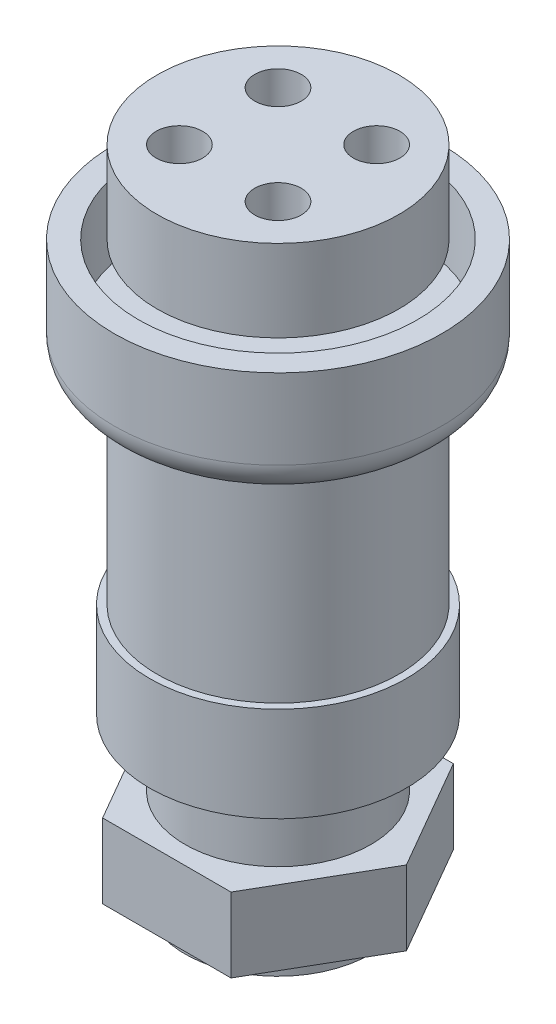
ISO-10303-21;
HEADER;
FILE_DESCRIPTION(('STEP AP214'),'2;1');
FILE_NAME('part.step','',(''),(''),'','','');
FILE_SCHEMA(('AUTOMOTIVE_DESIGN { 1 0 10303 214 1 1 1 1 }'));
ENDSEC;
DATA;
#1=APPLICATION_CONTEXT('core data for automotive mechanical design processes');
#2=APPLICATION_PROTOCOL_DEFINITION('international standard','automotive_design',2000,#1);
#3=PRODUCT_CONTEXT('',#1,'mechanical');
#4=PRODUCT('Part','Part','',(#3));
#5=PRODUCT_RELATED_PRODUCT_CATEGORY('part','',(#4));
#6=PRODUCT_DEFINITION_FORMATION('','',#4);
#7=PRODUCT_DEFINITION_CONTEXT('part definition',#1,'design');
#8=PRODUCT_DEFINITION('design','',#6,#7);
#9=PRODUCT_DEFINITION_SHAPE('','',#8);
#10=(LENGTH_UNIT() NAMED_UNIT(*) SI_UNIT(.MILLI.,.METRE.));
#11=(NAMED_UNIT(*) PLANE_ANGLE_UNIT() SI_UNIT($,.RADIAN.));
#12=(NAMED_UNIT(*) SI_UNIT($,.STERADIAN.) SOLID_ANGLE_UNIT());
#13=UNCERTAINTY_MEASURE_WITH_UNIT(LENGTH_MEASURE(1.E-05),#10,'distance_accuracy_value','');
#14=(GEOMETRIC_REPRESENTATION_CONTEXT(3) GLOBAL_UNCERTAINTY_ASSIGNED_CONTEXT((#13)) GLOBAL_UNIT_ASSIGNED_CONTEXT((#10,
#11,#12)) REPRESENTATION_CONTEXT('',''));
#15=CARTESIAN_POINT('',(0.,0.,0.));
#16=DIRECTION('',(0.,0.,1.));
#17=DIRECTION('',(1.,0.,0.));
#18=AXIS2_PLACEMENT_3D('',#15,#16,#17);
#19=CARTESIAN_POINT('',(14.2491519079586,-25.873716184257,0.));
#20=DIRECTION('',(0.,-1.,0.));
#21=DIRECTION('',(0.,0.,-1.));
#22=AXIS2_PLACEMENT_3D('',#19,#20,#21);
#23=CYLINDRICAL_SURFACE('',#22,5.);
#24=CARTESIAN_POINT('',(14.2491519079586,-18.17860251967,0.));
#25=DIRECTION('',(0.,-1.,0.));
#26=DIRECTION('',(0.,0.,-1.));
#27=AXIS2_PLACEMENT_3D('',#24,#25,#26);
#28=CIRCLE('',#27,5.);
#29=CARTESIAN_POINT('',(14.2491519079586,-18.17860251967,-5.));
#30=VERTEX_POINT('',#29);
#31=EDGE_CURVE('E251',#30,#30,#28,.T.);
#32=ORIENTED_EDGE('',*,*,#31,.T.);
#33=EDGE_LOOP('',(#32));
#34=FACE_BOUND('',#33,.T.);
#35=CARTESIAN_POINT('',(14.2491519079586,-20.773716184257,0.));
#36=DIRECTION('',(0.,-1.,0.));
#37=DIRECTION('',(0.,0.,-1.));
#38=AXIS2_PLACEMENT_3D('',#35,#36,#37);
#39=CIRCLE('',#38,5.);
#40=CARTESIAN_POINT('',(14.2491519079586,-20.773716184257,-5.));
#41=VERTEX_POINT('',#40);
#42=EDGE_CURVE('E225',#41,#41,#39,.F.);
#43=ORIENTED_EDGE('',*,*,#42,.T.);
#44=EDGE_LOOP('',(#43));
#45=FACE_BOUND('',#44,.T.);
#46=ADVANCED_FACE('F42',(#34,#45),#23,.T.);
#47=CARTESIAN_POINT('',(21.4991519079586,-1.1,0.));
#48=DIRECTION('',(0.,-1.,0.));
#49=DIRECTION('',(0.,0.,-1.));
#50=AXIS2_PLACEMENT_3D('',#47,#48,#49);
#51=PLANE('',#50);
#52=CARTESIAN_POINT('',(14.2491519079586,-1.1,0.));
#53=DIRECTION('',(0.,-1.,0.));
#54=DIRECTION('',(0.,0.,-1.));
#55=AXIS2_PLACEMENT_3D('',#52,#53,#54);
#56=CIRCLE('',#55,7.1);
#57=CARTESIAN_POINT('',(14.2491519079586,-1.1,-7.1));
#58=VERTEX_POINT('',#57);
#59=EDGE_CURVE('E244',#58,#58,#56,.T.);
#60=ORIENTED_EDGE('',*,*,#59,.T.);
#61=EDGE_LOOP('',(#60));
#62=FACE_BOUND('',#61,.T.);
#63=CARTESIAN_POINT('',(14.2491519079586,-1.1,0.));
#64=DIRECTION('',(0.,-1.,0.));
#65=DIRECTION('',(0.,0.,-1.));
#66=AXIS2_PLACEMENT_3D('',#63,#64,#65);
#67=CIRCLE('',#66,6.5);
#68=CARTESIAN_POINT('',(14.2491519079586,-1.1,-6.5));
#69=VERTEX_POINT('',#68);
#70=EDGE_CURVE('E240',#69,#69,#67,.T.);
#71=ORIENTED_EDGE('',*,*,#70,.F.);
#72=EDGE_LOOP('',(#71));
#73=FACE_BOUND('',#72,.T.);
#74=ADVANCED_FACE('F181',(#62,#73),#51,.T.);
#75=CARTESIAN_POINT('',(14.2491519079586,-25.873716184257,0.));
#76=DIRECTION('',(0.,-1.,0.));
#77=DIRECTION('',(0.,0.,-1.));
#78=AXIS2_PLACEMENT_3D('',#75,#76,#77);
#79=CYLINDRICAL_SURFACE('',#78,6.5);
#80=ORIENTED_EDGE('',*,*,#70,.T.);
#81=EDGE_LOOP('',(#80));
#82=FACE_BOUND('',#81,.T.);
#83=CARTESIAN_POINT('',(14.2491519079586,-12.1,0.));
#84=DIRECTION('',(0.,-1.,0.));
#85=DIRECTION('',(0.,0.,-1.));
#86=AXIS2_PLACEMENT_3D('',#83,#84,#85);
#87=CIRCLE('',#86,6.5);
#88=CARTESIAN_POINT('',(14.2491519079586,-12.1,-6.5));
#89=VERTEX_POINT('',#88);
#90=EDGE_CURVE('E243',#89,#89,#87,.T.);
#91=ORIENTED_EDGE('',*,*,#90,.F.);
#92=EDGE_LOOP('',(#91));
#93=FACE_BOUND('',#92,.T.);
#94=ADVANCED_FACE('F186',(#82,#93),#79,.T.);
#95=CARTESIAN_POINT('',(20.7491519079586,-12.1,0.));
#96=DIRECTION('',(0.,1.,0.));
#97=DIRECTION('',(0.,0.,1.));
#98=AXIS2_PLACEMENT_3D('',#95,#96,#97);
#99=PLANE('',#98);
#100=ORIENTED_EDGE('',*,*,#90,.T.);
#101=EDGE_LOOP('',(#100));
#102=FACE_BOUND('',#101,.T.);
#103=CARTESIAN_POINT('',(14.2491519079586,-12.1,0.));
#104=DIRECTION('',(0.,-1.,0.));
#105=DIRECTION('',(0.,0.,-1.));
#106=AXIS2_PLACEMENT_3D('',#103,#104,#105);
#107=CIRCLE('',#106,6.9);
#108=CARTESIAN_POINT('',(14.2491519079586,-12.1,-6.9));
#109=VERTEX_POINT('',#108);
#110=EDGE_CURVE('E247',#109,#109,#107,.T.);
#111=ORIENTED_EDGE('',*,*,#110,.F.);
#112=EDGE_LOOP('',(#111));
#113=FACE_BOUND('',#112,.T.);
#114=ADVANCED_FACE('F268',(#102,#113),#99,.T.);
#115=CARTESIAN_POINT('',(14.2491519079586,-25.873716184257,0.));
#116=DIRECTION('',(0.,-1.,0.));
#117=DIRECTION('',(0.,0.,-1.));
#118=AXIS2_PLACEMENT_3D('',#115,#116,#117);
#119=CYLINDRICAL_SURFACE('',#118,6.9);
#120=ORIENTED_EDGE('',*,*,#110,.T.);
#121=EDGE_LOOP('',(#120));
#122=FACE_BOUND('',#121,.T.);
#123=CARTESIAN_POINT('',(14.2491519079586,-17.2,0.));
#124=DIRECTION('',(0.,-1.,0.));
#125=DIRECTION('',(0.,0.,-1.));
#126=AXIS2_PLACEMENT_3D('',#123,#124,#125);
#127=CIRCLE('',#126,6.9);
#128=CARTESIAN_POINT('',(14.2491519079586,-17.2,-6.9));
#129=VERTEX_POINT('',#128);
#130=EDGE_CURVE('E152',#129,#129,#127,.T.);
#131=ORIENTED_EDGE('',*,*,#130,.F.);
#132=EDGE_LOOP('',(#131));
#133=FACE_BOUND('',#132,.T.);
#134=ADVANCED_FACE('F271',(#122,#133),#119,.T.);
#135=CARTESIAN_POINT('',(14.2491519079586,-18.17860251967,0.));
#136=DIRECTION('',(0.,1.,0.));
#137=DIRECTION('',(0.,0.,1.));
#138=AXIS2_PLACEMENT_3D('',#135,#136,#137);
#139=CONICAL_SURFACE('',#138,5.,1.09517820827461);
#140=ORIENTED_EDGE('',*,*,#130,.T.);
#141=EDGE_LOOP('',(#140));
#142=FACE_BOUND('',#141,.T.);
#143=ORIENTED_EDGE('',*,*,#31,.F.);
#144=EDGE_LOOP('',(#143));
#145=FACE_BOUND('',#144,.T.);
#146=ADVANCED_FACE('F193',(#142,#145),#139,.T.);
#147=CARTESIAN_POINT('',(10.7991519079585,-20.773716184257,5.97557528611259));
#148=DIRECTION('',(-0.866025403784441,0.,0.499999999999995));
#149=DIRECTION('',(0.499999999999995,0.,0.866025403784442));
#150=AXIS2_PLACEMENT_3D('',#147,#148,#149);
#151=PLANE('',#150);
#152=DIRECTION('',(-0.499999999999995,0.,-0.866025403784441));
#153=VECTOR('',#152,1.);
#154=CARTESIAN_POINT('',(10.7991519079585,-24.773716184257,5.97557528611259));
#155=LINE('',#154,#153);
#156=CARTESIAN_POINT('',(10.7991519079585,-24.773716184257,5.97557528611259));
#157=VERTEX_POINT('',#156);
#158=CARTESIAN_POINT('',(7.34915190795857,-24.773716184257,0.));
#159=VERTEX_POINT('',#158);
#160=EDGE_CURVE('E113',#157,#159,#155,.T.);
#161=ORIENTED_EDGE('',*,*,#160,.F.);
#162=DIRECTION('',(0.,-1.,0.));
#163=VECTOR('',#162,1.);
#164=CARTESIAN_POINT('',(10.7991519079585,-20.773716184257,5.97557528611259));
#165=LINE('',#164,#163);
#166=CARTESIAN_POINT('',(10.7991519079585,-20.773716184257,5.97557528611259));
#167=VERTEX_POINT('',#166);
#168=EDGE_CURVE('E100',#167,#157,#165,.T.);
#169=ORIENTED_EDGE('',*,*,#168,.F.);
#170=DIRECTION('',(-0.499999999999995,0.,-0.866025403784441));
#171=VECTOR('',#170,1.);
#172=CARTESIAN_POINT('',(10.7991519079585,-20.773716184257,5.97557528611259));
#173=LINE('',#172,#171);
#174=CARTESIAN_POINT('',(7.34915190795857,-20.773716184257,0.));
#175=VERTEX_POINT('',#174);
#176=EDGE_CURVE('E150',#167,#175,#173,.T.);
#177=ORIENTED_EDGE('',*,*,#176,.T.);
#178=DIRECTION('',(0.,-1.,0.));
#179=VECTOR('',#178,1.);
#180=CARTESIAN_POINT('',(7.34915190795857,-20.773716184257,0.));
#181=LINE('',#180,#179);
#182=EDGE_CURVE('E115',#175,#159,#181,.T.);
#183=ORIENTED_EDGE('',*,*,#182,.T.);
#184=EDGE_LOOP('',(#161,#169,#177,#183));
#185=FACE_BOUND('',#184,.T.);
#186=ADVANCED_FACE('F114',(#185),#151,.T.);
#187=CARTESIAN_POINT('',(17.6991519079585,-20.773716184257,5.97557528611266));
#188=DIRECTION('',(0.,0.,1.));
#189=DIRECTION('',(1.,0.,0.));
#190=AXIS2_PLACEMENT_3D('',#187,#188,#189);
#191=PLANE('',#190);
#192=DIRECTION('',(-1.,0.,0.));
#193=VECTOR('',#192,1.);
#194=CARTESIAN_POINT('',(17.6991519079585,-24.773716184257,5.97557528611266));
#195=LINE('',#194,#193);
#196=CARTESIAN_POINT('',(17.6991519079585,-24.773716184257,5.97557528611266));
#197=VERTEX_POINT('',#196);
#198=EDGE_CURVE('E104',#197,#157,#195,.T.);
#199=ORIENTED_EDGE('',*,*,#198,.F.);
#200=DIRECTION('',(0.,-1.,0.));
#201=VECTOR('',#200,1.);
#202=CARTESIAN_POINT('',(17.6991519079585,-20.773716184257,5.97557528611266));
#203=LINE('',#202,#201);
#204=CARTESIAN_POINT('',(17.6991519079585,-20.773716184257,5.97557528611266));
#205=VERTEX_POINT('',#204);
#206=EDGE_CURVE('E142',#205,#197,#203,.T.);
#207=ORIENTED_EDGE('',*,*,#206,.F.);
#208=DIRECTION('',(-1.,0.,0.));
#209=VECTOR('',#208,1.);
#210=CARTESIAN_POINT('',(17.6991519079585,-20.773716184257,5.97557528611266));
#211=LINE('',#210,#209);
#212=EDGE_CURVE('E106',#205,#167,#211,.T.);
#213=ORIENTED_EDGE('',*,*,#212,.T.);
#214=ORIENTED_EDGE('',*,*,#168,.T.);
#215=EDGE_LOOP('',(#199,#207,#213,#214));
#216=FACE_BOUND('',#215,.T.);
#217=ADVANCED_FACE('F102',(#216),#191,.T.);
#218=CARTESIAN_POINT('',(21.1491519079586,-20.773716184257,0.));
#219=DIRECTION('',(0.866025403784435,0.,0.500000000000007));
#220=DIRECTION('',(0.500000000000007,0.,-0.866025403784435));
#221=AXIS2_PLACEMENT_3D('',#218,#219,#220);
#222=PLANE('',#221);
#223=DIRECTION('',(-0.500000000000007,0.,0.866025403784435));
#224=VECTOR('',#223,1.);
#225=CARTESIAN_POINT('',(21.1491519079586,-24.773716184257,0.));
#226=LINE('',#225,#224);
#227=CARTESIAN_POINT('',(21.1491519079586,-24.773716184257,0.));
#228=VERTEX_POINT('',#227);
#229=EDGE_CURVE('E124',#228,#197,#226,.T.);
#230=ORIENTED_EDGE('',*,*,#229,.F.);
#231=DIRECTION('',(0.,-1.,0.));
#232=VECTOR('',#231,1.);
#233=CARTESIAN_POINT('',(21.1491519079586,-20.773716184257,0.));
#234=LINE('',#233,#232);
#235=CARTESIAN_POINT('',(21.1491519079586,-20.773716184257,0.));
#236=VERTEX_POINT('',#235);
#237=EDGE_CURVE('E91',#236,#228,#234,.T.);
#238=ORIENTED_EDGE('',*,*,#237,.F.);
#239=DIRECTION('',(-0.500000000000007,0.,0.866025403784435));
#240=VECTOR('',#239,1.);
#241=CARTESIAN_POINT('',(21.1491519079586,-20.773716184257,0.));
#242=LINE('',#241,#240);
#243=EDGE_CURVE('E110',#236,#205,#242,.T.);
#244=ORIENTED_EDGE('',*,*,#243,.T.);
#245=ORIENTED_EDGE('',*,*,#206,.T.);
#246=EDGE_LOOP('',(#230,#238,#244,#245));
#247=FACE_BOUND('',#246,.T.);
#248=ADVANCED_FACE('F210',(#247),#222,.T.);
#249=CARTESIAN_POINT('',(17.6991519079586,-20.773716184257,-5.97557528611261));
#250=DIRECTION('',(0.866025403784442,0.,-0.499999999999995));
#251=DIRECTION('',(-0.499999999999995,0.,-0.866025403784442));
#252=AXIS2_PLACEMENT_3D('',#249,#250,#251);
#253=PLANE('',#252);
#254=DIRECTION('',(0.499999999999995,0.,0.866025403784442));
#255=VECTOR('',#254,1.);
#256=CARTESIAN_POINT('',(17.6991519079586,-24.773716184257,-5.97557528611261));
#257=LINE('',#256,#255);
#258=CARTESIAN_POINT('',(17.6991519079586,-24.773716184257,-5.97557528611261));
#259=VERTEX_POINT('',#258);
#260=EDGE_CURVE('E130',#259,#228,#257,.T.);
#261=ORIENTED_EDGE('',*,*,#260,.F.);
#262=DIRECTION('',(0.,-1.,0.));
#263=VECTOR('',#262,1.);
#264=CARTESIAN_POINT('',(17.6991519079586,-20.773716184257,-5.97557528611261));
#265=LINE('',#264,#263);
#266=CARTESIAN_POINT('',(17.6991519079586,-20.773716184257,-5.97557528611261));
#267=VERTEX_POINT('',#266);
#268=EDGE_CURVE('E147',#267,#259,#265,.T.);
#269=ORIENTED_EDGE('',*,*,#268,.F.);
#270=DIRECTION('',(0.499999999999995,0.,0.866025403784442));
#271=VECTOR('',#270,1.);
#272=CARTESIAN_POINT('',(17.6991519079586,-20.773716184257,-5.97557528611261));
#273=LINE('',#272,#271);
#274=EDGE_CURVE('E143',#267,#236,#273,.T.);
#275=ORIENTED_EDGE('',*,*,#274,.T.);
#276=ORIENTED_EDGE('',*,*,#237,.T.);
#277=EDGE_LOOP('',(#261,#269,#275,#276));
#278=FACE_BOUND('',#277,.T.);
#279=ADVANCED_FACE('F207',(#278),#253,.T.);
#280=CARTESIAN_POINT('',(10.7991519079586,-20.773716184257,-5.97557528611263));
#281=DIRECTION('',(0.,0.,-1.));
#282=DIRECTION('',(-1.,0.,0.));
#283=AXIS2_PLACEMENT_3D('',#280,#281,#282);
#284=PLANE('',#283);
#285=DIRECTION('',(1.,0.,0.));
#286=VECTOR('',#285,1.);
#287=CARTESIAN_POINT('',(10.7991519079586,-24.773716184257,-5.97557528611263));
#288=LINE('',#287,#286);
#289=CARTESIAN_POINT('',(10.7991519079586,-24.773716184257,-5.97557528611263));
#290=VERTEX_POINT('',#289);
#291=EDGE_CURVE('E135',#290,#259,#288,.T.);
#292=ORIENTED_EDGE('',*,*,#291,.F.);
#293=DIRECTION('',(0.,-1.,0.));
#294=VECTOR('',#293,1.);
#295=CARTESIAN_POINT('',(10.7991519079586,-20.773716184257,-5.97557528611263));
#296=LINE('',#295,#294);
#297=CARTESIAN_POINT('',(10.7991519079586,-20.773716184257,-5.97557528611263));
#298=VERTEX_POINT('',#297);
#299=EDGE_CURVE('E58',#298,#290,#296,.T.);
#300=ORIENTED_EDGE('',*,*,#299,.F.);
#301=DIRECTION('',(1.,0.,0.));
#302=VECTOR('',#301,1.);
#303=CARTESIAN_POINT('',(10.7991519079586,-20.773716184257,-5.97557528611263));
#304=LINE('',#303,#302);
#305=EDGE_CURVE('E145',#298,#267,#304,.T.);
#306=ORIENTED_EDGE('',*,*,#305,.T.);
#307=ORIENTED_EDGE('',*,*,#268,.T.);
#308=EDGE_LOOP('',(#292,#300,#306,#307));
#309=FACE_BOUND('',#308,.T.);
#310=ADVANCED_FACE('F204',(#309),#284,.T.);
#311=CARTESIAN_POINT('',(7.34915190795857,-20.773716184257,0.));
#312=DIRECTION('',(-0.866025403784438,0.,-0.500000000000001));
#313=DIRECTION('',(-0.500000000000001,0.,0.866025403784438));
#314=AXIS2_PLACEMENT_3D('',#311,#312,#313);
#315=PLANE('',#314);
#316=DIRECTION('',(0.500000000000001,0.,-0.866025403784438));
#317=VECTOR('',#316,1.);
#318=CARTESIAN_POINT('',(7.34915190795857,-24.773716184257,0.));
#319=LINE('',#318,#317);
#320=EDGE_CURVE('E118',#159,#290,#319,.T.);
#321=ORIENTED_EDGE('',*,*,#320,.F.);
#322=ORIENTED_EDGE('',*,*,#182,.F.);
#323=DIRECTION('',(0.500000000000001,0.,-0.866025403784438));
#324=VECTOR('',#323,1.);
#325=CARTESIAN_POINT('',(7.34915190795857,-20.773716184257,0.));
#326=LINE('',#325,#324);
#327=EDGE_CURVE('E148',#175,#298,#326,.T.);
#328=ORIENTED_EDGE('',*,*,#327,.T.);
#329=ORIENTED_EDGE('',*,*,#299,.T.);
#330=EDGE_LOOP('',(#321,#322,#328,#329));
#331=FACE_BOUND('',#330,.T.);
#332=ADVANCED_FACE('F200',(#331),#315,.T.);
#333=CARTESIAN_POINT('',(0.,-20.773716184257,0.));
#334=DIRECTION('',(0.,-1.,0.));
#335=DIRECTION('',(0.,0.,-1.));
#336=AXIS2_PLACEMENT_3D('',#333,#334,#335);
#337=PLANE('',#336);
#338=ORIENTED_EDGE('',*,*,#42,.F.);
#339=EDGE_LOOP('',(#338));
#340=FACE_BOUND('',#339,.T.);
#341=ORIENTED_EDGE('',*,*,#176,.F.);
#342=ORIENTED_EDGE('',*,*,#212,.F.);
#343=ORIENTED_EDGE('',*,*,#243,.F.);
#344=ORIENTED_EDGE('',*,*,#274,.F.);
#345=ORIENTED_EDGE('',*,*,#305,.F.);
#346=ORIENTED_EDGE('',*,*,#327,.F.);
#347=EDGE_LOOP('',(#341,#342,#343,#344,#345,#346));
#348=FACE_BOUND('',#347,.T.);
#349=ADVANCED_FACE('F203',(#340,#348),#337,.F.);
#350=CARTESIAN_POINT('',(0.,-24.773716184257,0.));
#351=DIRECTION('',(0.,-1.,0.));
#352=DIRECTION('',(0.,0.,-1.));
#353=AXIS2_PLACEMENT_3D('',#350,#351,#352);
#354=PLANE('',#353);
#355=CARTESIAN_POINT('',(14.2491519079586,-24.773716184257,0.));
#356=DIRECTION('',(0.,-1.,0.));
#357=DIRECTION('',(0.,0.,-1.));
#358=AXIS2_PLACEMENT_3D('',#355,#356,#357);
#359=CIRCLE('',#358,5.);
#360=CARTESIAN_POINT('',(14.2491519079586,-24.773716184257,-5.));
#361=VERTEX_POINT('',#360);
#362=EDGE_CURVE('E119',#361,#361,#359,.F.);
#363=ORIENTED_EDGE('',*,*,#362,.T.);
#364=EDGE_LOOP('',(#363));
#365=FACE_BOUND('',#364,.T.);
#366=ORIENTED_EDGE('',*,*,#160,.T.);
#367=ORIENTED_EDGE('',*,*,#320,.T.);
#368=ORIENTED_EDGE('',*,*,#291,.T.);
#369=ORIENTED_EDGE('',*,*,#260,.T.);
#370=ORIENTED_EDGE('',*,*,#229,.T.);
#371=ORIENTED_EDGE('',*,*,#198,.T.);
#372=EDGE_LOOP('',(#366,#367,#368,#369,#370,#371));
#373=FACE_BOUND('',#372,.T.);
#374=ADVANCED_FACE('F122',(#365,#373),#354,.T.);
#375=CARTESIAN_POINT('',(19.2491519079586,-25.873716184257,0.));
#376=DIRECTION('',(0.,-1.,0.));
#377=DIRECTION('',(0.,0.,-1.));
#378=AXIS2_PLACEMENT_3D('',#375,#376,#377);
#379=PLANE('',#378);
#380=CARTESIAN_POINT('',(14.2491519079586,-25.873716184257,0.));
#381=DIRECTION('',(0.,-1.,0.));
#382=DIRECTION('',(0.,0.,-1.));
#383=AXIS2_PLACEMENT_3D('',#380,#381,#382);
#384=CIRCLE('',#383,5.);
#385=CARTESIAN_POINT('',(14.2491519079586,-25.873716184257,-5.));
#386=VERTEX_POINT('',#385);
#387=EDGE_CURVE('E125',#386,#386,#384,.T.);
#388=ORIENTED_EDGE('',*,*,#387,.T.);
#389=EDGE_LOOP('',(#388));
#390=FACE_BOUND('',#389,.T.);
#391=ADVANCED_FACE('F175',(#390),#379,.T.);
#392=ORIENTED_EDGE('',*,*,#362,.F.);
#393=EDGE_LOOP('',(#392));
#394=FACE_BOUND('',#393,.T.);
#395=ORIENTED_EDGE('',*,*,#387,.F.);
#396=EDGE_LOOP('',(#395));
#397=FACE_BOUND('',#396,.T.);
#398=ADVANCED_FACE('F169',(#394,#397),#23,.T.);
#399=CARTESIAN_POINT('',(14.2491519079586,4.9,0.));
#400=DIRECTION('',(0.,-1.,0.));
#401=DIRECTION('',(0.,0.,-1.));
#402=AXIS2_PLACEMENT_3D('',#399,#400,#401);
#403=CYLINDRICAL_SURFACE('',#402,8.8);
#404=CARTESIAN_POINT('',(14.2491519079586,0.6,0.));
#405=DIRECTION('',(0.,-1.,0.));
#406=DIRECTION('',(0.,0.,-1.));
#407=AXIS2_PLACEMENT_3D('',#404,#405,#406);
#408=CIRCLE('',#407,8.8);
#409=CARTESIAN_POINT('',(14.2491519079586,0.6,-8.8));
#410=VERTEX_POINT('',#409);
#411=EDGE_CURVE('E128',#410,#410,#408,.F.);
#412=ORIENTED_EDGE('',*,*,#411,.T.);
#413=EDGE_LOOP('',(#412));
#414=FACE_BOUND('',#413,.T.);
#415=CARTESIAN_POINT('',(14.2491519079586,4.9,0.));
#416=DIRECTION('',(0.,-1.,0.));
#417=DIRECTION('',(0.,0.,-1.));
#418=AXIS2_PLACEMENT_3D('',#415,#416,#417);
#419=CIRCLE('',#418,8.8);
#420=CARTESIAN_POINT('',(14.2491519079586,4.9,-8.8));
#421=VERTEX_POINT('',#420);
#422=EDGE_CURVE('E153',#421,#421,#419,.T.);
#423=ORIENTED_EDGE('',*,*,#422,.T.);
#424=EDGE_LOOP('',(#423));
#425=FACE_BOUND('',#424,.T.);
#426=ADVANCED_FACE('F164',(#414,#425),#403,.T.);
#427=CARTESIAN_POINT('',(14.2491519079586,4.9,0.));
#428=DIRECTION('',(0.,-1.,0.));
#429=DIRECTION('',(0.,0.,-1.));
#430=AXIS2_PLACEMENT_3D('',#427,#428,#429);
#431=PLANE('',#430);
#432=CARTESIAN_POINT('',(14.2491519079586,4.9,0.));
#433=DIRECTION('',(0.,1.,0.));
#434=DIRECTION('',(0.,0.,1.));
#435=AXIS2_PLACEMENT_3D('',#432,#433,#434);
#436=CIRCLE('',#435,7.5);
#437=CARTESIAN_POINT('',(14.2491519079586,4.9,7.5));
#438=VERTEX_POINT('',#437);
#439=EDGE_CURVE('E51',#438,#438,#436,.T.);
#440=ORIENTED_EDGE('',*,*,#439,.F.);
#441=EDGE_LOOP('',(#440));
#442=FACE_BOUND('',#441,.T.);
#443=ORIENTED_EDGE('',*,*,#422,.F.);
#444=EDGE_LOOP('',(#443));
#445=FACE_BOUND('',#444,.T.);
#446=ADVANCED_FACE('F160',(#442,#445),#431,.F.);
#447=CARTESIAN_POINT('',(14.2491519079586,0.6,0.));
#448=DIRECTION('',(0.,-1.,0.));
#449=DIRECTION('',(0.,0.,-1.));
#450=AXIS2_PLACEMENT_3D('',#447,#448,#449);
#451=TOROIDAL_SURFACE('',#450,7.1,1.7);
#452=ORIENTED_EDGE('',*,*,#411,.F.);
#453=EDGE_LOOP('',(#452));
#454=FACE_BOUND('',#453,.T.);
#455=ORIENTED_EDGE('',*,*,#59,.F.);
#456=EDGE_LOOP('',(#455));
#457=FACE_BOUND('',#456,.T.);
#458=ADVANCED_FACE('F163',(#454,#457),#451,.T.);
#459=CARTESIAN_POINT('',(14.2491519079586,0.9,0.));
#460=DIRECTION('',(0.,1.,0.));
#461=DIRECTION('',(0.,0.,1.));
#462=AXIS2_PLACEMENT_3D('',#459,#460,#461);
#463=CYLINDRICAL_SURFACE('',#462,7.5);
#464=CARTESIAN_POINT('',(14.2491519079586,0.9,0.));
#465=DIRECTION('',(0.,1.,0.));
#466=DIRECTION('',(0.,0.,1.));
#467=AXIS2_PLACEMENT_3D('',#464,#465,#466);
#468=CIRCLE('',#467,7.5);
#469=CARTESIAN_POINT('',(14.2491519079586,0.9,7.5));
#470=VERTEX_POINT('',#469);
#471=EDGE_CURVE('E12',#470,#470,#468,.T.);
#472=ORIENTED_EDGE('',*,*,#471,.F.);
#473=EDGE_LOOP('',(#472));
#474=FACE_BOUND('',#473,.T.);
#475=ORIENTED_EDGE('',*,*,#439,.T.);
#476=EDGE_LOOP('',(#475));
#477=FACE_BOUND('',#476,.T.);
#478=ADVANCED_FACE('F158',(#474,#477),#463,.F.);
#479=CARTESIAN_POINT('',(14.2491519079586,0.9,0.));
#480=DIRECTION('',(0.,1.,0.));
#481=DIRECTION('',(0.,0.,1.));
#482=AXIS2_PLACEMENT_3D('',#479,#480,#481);
#483=PLANE('',#482);
#484=ORIENTED_EDGE('',*,*,#471,.T.);
#485=EDGE_LOOP('',(#484));
#486=FACE_BOUND('',#485,.T.);
#487=ADVANCED_FACE('F44',(#486),#483,.T.);
#488=CLOSED_SHELL('',(#46,#74,#94,#114,#134,#146,#186,#217,#248,#279,#310,#332,#349,#374,#391,
#398,#426,#446,#458,#478,#487));
#489=MANIFOLD_SOLID_BREP('B2',#488);
#490=CARTESIAN_POINT('',(14.2491519079586,-25.873716184257,0.));
#491=DIRECTION('',(0.,-1.,0.));
#492=DIRECTION('',(0.,0.,-1.));
#493=AXIS2_PLACEMENT_3D('',#490,#491,#492);
#494=CYLINDRICAL_SURFACE('',#493,6.5);
#495=CARTESIAN_POINT('',(14.2491519079586,9.3,0.));
#496=DIRECTION('',(0.,-1.,0.));
#497=DIRECTION('',(0.,0.,-1.));
#498=AXIS2_PLACEMENT_3D('',#495,#496,#497);
#499=CIRCLE('',#498,6.5);
#500=CARTESIAN_POINT('',(14.2491519079586,9.3,-6.5));
#501=VERTEX_POINT('',#500);
#502=EDGE_CURVE('E41',#501,#501,#499,.T.);
#503=ORIENTED_EDGE('',*,*,#502,.T.);
#504=EDGE_LOOP('',(#503));
#505=FACE_BOUND('',#504,.T.);
#506=CARTESIAN_POINT('',(14.2491519079586,4.9,0.));
#507=DIRECTION('',(0.,1.,0.));
#508=DIRECTION('',(0.,0.,1.));
#509=AXIS2_PLACEMENT_3D('',#506,#507,#508);
#510=CIRCLE('',#509,6.5);
#511=CARTESIAN_POINT('',(14.2491519079586,4.9,6.5));
#512=VERTEX_POINT('',#511);
#513=EDGE_CURVE('E437',#512,#512,#510,.F.);
#514=ORIENTED_EDGE('',*,*,#513,.F.);
#515=EDGE_LOOP('',(#514));
#516=FACE_BOUND('',#515,.T.);
#517=ADVANCED_FACE('F414',(#505,#516),#494,.T.);
#518=CARTESIAN_POINT('',(11.5991519079586,3.3,-2.65));
#519=DIRECTION('',(0.,1.,0.));
#520=DIRECTION('',(0.,0.,1.));
#521=AXIS2_PLACEMENT_3D('',#518,#519,#520);
#522=CYLINDRICAL_SURFACE('',#521,1.25);
#523=CARTESIAN_POINT('',(11.5991519079586,9.3,-2.65));
#524=DIRECTION('',(0.,1.,0.));
#525=DIRECTION('',(0.,0.,1.));
#526=AXIS2_PLACEMENT_3D('',#523,#524,#525);
#527=CIRCLE('',#526,1.25);
#528=CARTESIAN_POINT('',(11.5991519079586,9.3,-1.4));
#529=VERTEX_POINT('',#528);
#530=EDGE_CURVE('E421',#529,#529,#527,.T.);
#531=ORIENTED_EDGE('',*,*,#530,.T.);
#532=EDGE_LOOP('',(#531));
#533=FACE_BOUND('',#532,.T.);
#534=CARTESIAN_POINT('',(11.5991519079586,4.9,-2.65));
#535=DIRECTION('',(0.,1.,0.));
#536=DIRECTION('',(0.,0.,1.));
#537=AXIS2_PLACEMENT_3D('',#534,#535,#536);
#538=CIRCLE('',#537,1.25);
#539=CARTESIAN_POINT('',(11.5991519079586,4.9,-1.4));
#540=VERTEX_POINT('',#539);
#541=EDGE_CURVE('E440',#540,#540,#538,.F.);
#542=ORIENTED_EDGE('',*,*,#541,.T.);
#543=EDGE_LOOP('',(#542));
#544=FACE_BOUND('',#543,.T.);
#545=ADVANCED_FACE('F464',(#533,#544),#522,.F.);
#546=CARTESIAN_POINT('',(16.8991519079586,3.3,-2.65));
#547=DIRECTION('',(0.,1.,0.));
#548=DIRECTION('',(0.,0.,1.));
#549=AXIS2_PLACEMENT_3D('',#546,#547,#548);
#550=CYLINDRICAL_SURFACE('',#549,1.25);
#551=CARTESIAN_POINT('',(16.8991519079586,9.3,-2.65));
#552=DIRECTION('',(0.,1.,0.));
#553=DIRECTION('',(0.,0.,1.));
#554=AXIS2_PLACEMENT_3D('',#551,#552,#553);
#555=CIRCLE('',#554,1.25);
#556=CARTESIAN_POINT('',(16.8991519079586,9.3,-1.4));
#557=VERTEX_POINT('',#556);
#558=EDGE_CURVE('E425',#557,#557,#555,.T.);
#559=ORIENTED_EDGE('',*,*,#558,.T.);
#560=EDGE_LOOP('',(#559));
#561=FACE_BOUND('',#560,.T.);
#562=CARTESIAN_POINT('',(16.8991519079586,4.9,-2.65));
#563=DIRECTION('',(0.,1.,0.));
#564=DIRECTION('',(0.,0.,1.));
#565=AXIS2_PLACEMENT_3D('',#562,#563,#564);
#566=CIRCLE('',#565,1.25);
#567=CARTESIAN_POINT('',(16.8991519079586,4.9,-1.4));
#568=VERTEX_POINT('',#567);
#569=EDGE_CURVE('E443',#568,#568,#566,.F.);
#570=ORIENTED_EDGE('',*,*,#569,.T.);
#571=EDGE_LOOP('',(#570));
#572=FACE_BOUND('',#571,.T.);
#573=ADVANCED_FACE('F466',(#561,#572),#550,.F.);
#574=CARTESIAN_POINT('',(16.8991519079586,3.3,2.65));
#575=DIRECTION('',(0.,1.,0.));
#576=DIRECTION('',(0.,0.,1.));
#577=AXIS2_PLACEMENT_3D('',#574,#575,#576);
#578=CYLINDRICAL_SURFACE('',#577,1.25);
#579=CARTESIAN_POINT('',(16.8991519079586,9.3,2.65));
#580=DIRECTION('',(0.,1.,0.));
#581=DIRECTION('',(0.,0.,1.));
#582=AXIS2_PLACEMENT_3D('',#579,#580,#581);
#583=CIRCLE('',#582,1.25);
#584=CARTESIAN_POINT('',(16.8991519079586,9.3,3.9));
#585=VERTEX_POINT('',#584);
#586=EDGE_CURVE('E429',#585,#585,#583,.T.);
#587=ORIENTED_EDGE('',*,*,#586,.T.);
#588=EDGE_LOOP('',(#587));
#589=FACE_BOUND('',#588,.T.);
#590=CARTESIAN_POINT('',(16.8991519079586,4.9,2.65));
#591=DIRECTION('',(0.,1.,0.));
#592=DIRECTION('',(0.,0.,1.));
#593=AXIS2_PLACEMENT_3D('',#590,#591,#592);
#594=CIRCLE('',#593,1.25);
#595=CARTESIAN_POINT('',(16.8991519079586,4.9,3.9));
#596=VERTEX_POINT('',#595);
#597=EDGE_CURVE('E446',#596,#596,#594,.F.);
#598=ORIENTED_EDGE('',*,*,#597,.T.);
#599=EDGE_LOOP('',(#598));
#600=FACE_BOUND('',#599,.T.);
#601=ADVANCED_FACE('F472',(#589,#600),#578,.F.);
#602=CARTESIAN_POINT('',(14.2491519079586,9.3,0.));
#603=DIRECTION('',(0.,1.,0.));
#604=DIRECTION('',(0.,0.,1.));
#605=AXIS2_PLACEMENT_3D('',#602,#603,#604);
#606=PLANE('',#605);
#607=CARTESIAN_POINT('',(11.5991519079586,9.3,2.65));
#608=DIRECTION('',(0.,1.,0.));
#609=DIRECTION('',(0.,0.,1.));
#610=AXIS2_PLACEMENT_3D('',#607,#608,#609);
#611=CIRCLE('',#610,1.25);
#612=CARTESIAN_POINT('',(11.5991519079586,9.3,3.9));
#613=VERTEX_POINT('',#612);
#614=EDGE_CURVE('E434',#613,#613,#611,.T.);
#615=ORIENTED_EDGE('',*,*,#614,.F.);
#616=EDGE_LOOP('',(#615));
#617=FACE_BOUND('',#616,.T.);
#618=ORIENTED_EDGE('',*,*,#586,.F.);
#619=EDGE_LOOP('',(#618));
#620=FACE_BOUND('',#619,.T.);
#621=ORIENTED_EDGE('',*,*,#558,.F.);
#622=EDGE_LOOP('',(#621));
#623=FACE_BOUND('',#622,.T.);
#624=ORIENTED_EDGE('',*,*,#530,.F.);
#625=EDGE_LOOP('',(#624));
#626=FACE_BOUND('',#625,.T.);
#627=ORIENTED_EDGE('',*,*,#502,.F.);
#628=EDGE_LOOP('',(#627));
#629=FACE_BOUND('',#628,.T.);
#630=ADVANCED_FACE('F416',(#617,#620,#623,#626,#629),#606,.T.);
#631=CARTESIAN_POINT('',(11.5991519079586,3.3,2.65));
#632=DIRECTION('',(0.,1.,0.));
#633=DIRECTION('',(0.,0.,1.));
#634=AXIS2_PLACEMENT_3D('',#631,#632,#633);
#635=CYLINDRICAL_SURFACE('',#634,1.25);
#636=ORIENTED_EDGE('',*,*,#614,.T.);
#637=EDGE_LOOP('',(#636));
#638=FACE_BOUND('',#637,.T.);
#639=CARTESIAN_POINT('',(11.5991519079586,4.9,2.65));
#640=DIRECTION('',(0.,1.,0.));
#641=DIRECTION('',(0.,0.,1.));
#642=AXIS2_PLACEMENT_3D('',#639,#640,#641);
#643=CIRCLE('',#642,1.25);
#644=CARTESIAN_POINT('',(11.5991519079586,4.9,3.9));
#645=VERTEX_POINT('',#644);
#646=EDGE_CURVE('E449',#645,#645,#643,.F.);
#647=ORIENTED_EDGE('',*,*,#646,.T.);
#648=EDGE_LOOP('',(#647));
#649=FACE_BOUND('',#648,.T.);
#650=ADVANCED_FACE('F453',(#638,#649),#635,.F.);
#651=CARTESIAN_POINT('',(14.2491519079586,4.9,0.));
#652=DIRECTION('',(0.,1.,0.));
#653=DIRECTION('',(0.,0.,1.));
#654=AXIS2_PLACEMENT_3D('',#651,#652,#653);
#655=PLANE('',#654);
#656=ORIENTED_EDGE('',*,*,#513,.T.);
#657=EDGE_LOOP('',(#656));
#658=FACE_BOUND('',#657,.T.);
#659=ORIENTED_EDGE('',*,*,#569,.F.);
#660=EDGE_LOOP('',(#659));
#661=FACE_BOUND('',#660,.T.);
#662=ORIENTED_EDGE('',*,*,#646,.F.);
#663=EDGE_LOOP('',(#662));
#664=FACE_BOUND('',#663,.T.);
#665=ORIENTED_EDGE('',*,*,#597,.F.);
#666=EDGE_LOOP('',(#665));
#667=FACE_BOUND('',#666,.T.);
#668=ORIENTED_EDGE('',*,*,#541,.F.);
#669=EDGE_LOOP('',(#668));
#670=FACE_BOUND('',#669,.T.);
#671=ADVANCED_FACE('F455',(#658,#661,#664,#667,#670),#655,.F.);
#672=CLOSED_SHELL('',(#517,#545,#573,#601,#630,#650,#671));
#673=MANIFOLD_SOLID_BREP('B6',#672);
#674=ADVANCED_BREP_SHAPE_REPRESENTATION('',(#18,#489,#673),#14);
#675=SHAPE_DEFINITION_REPRESENTATION(#9,#674);
ENDSEC;
END-ISO-10303-21;
